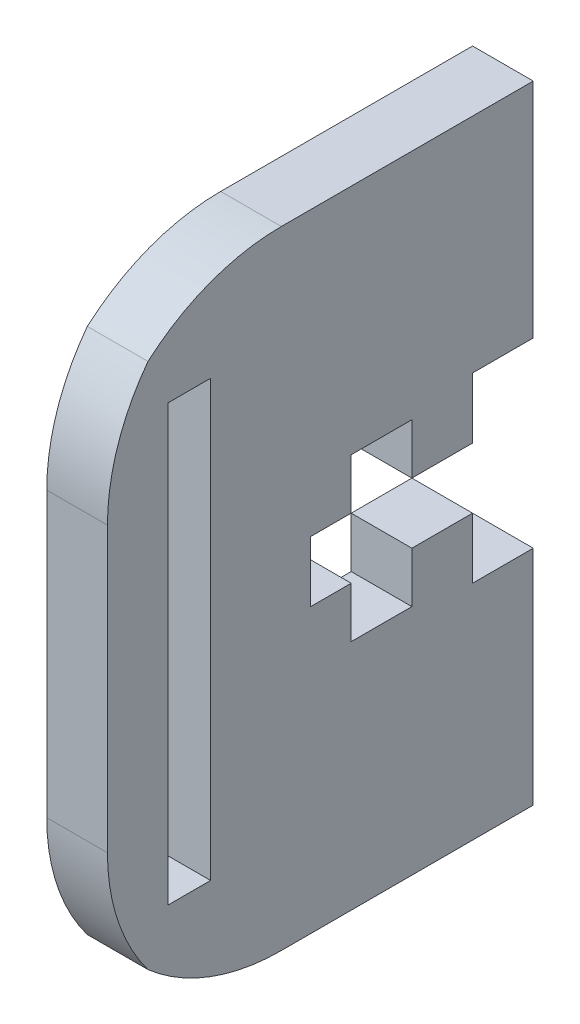
ISO-10303-21;
HEADER;
FILE_DESCRIPTION(('STEP AP214'),'2;1');
FILE_NAME('part.step','',(''),(''),'','','');
FILE_SCHEMA(('AUTOMOTIVE_DESIGN { 1 0 10303 214 1 1 1 1 }'));
ENDSEC;
DATA;
#1=APPLICATION_CONTEXT('core data for automotive mechanical design processes');
#2=APPLICATION_PROTOCOL_DEFINITION('international standard','automotive_design',2000,#1);
#3=PRODUCT_CONTEXT('',#1,'mechanical');
#4=PRODUCT('Part','Part','',(#3));
#5=PRODUCT_RELATED_PRODUCT_CATEGORY('part','',(#4));
#6=PRODUCT_DEFINITION_FORMATION('','',#4);
#7=PRODUCT_DEFINITION_CONTEXT('part definition',#1,'design');
#8=PRODUCT_DEFINITION('design','',#6,#7);
#9=PRODUCT_DEFINITION_SHAPE('','',#8);
#10=(LENGTH_UNIT() NAMED_UNIT(*) SI_UNIT(.MILLI.,.METRE.));
#11=(NAMED_UNIT(*) PLANE_ANGLE_UNIT() SI_UNIT($,.RADIAN.));
#12=(NAMED_UNIT(*) SI_UNIT($,.STERADIAN.) SOLID_ANGLE_UNIT());
#13=UNCERTAINTY_MEASURE_WITH_UNIT(LENGTH_MEASURE(1.E-05),#10,'distance_accuracy_value','');
#14=(GEOMETRIC_REPRESENTATION_CONTEXT(3) GLOBAL_UNCERTAINTY_ASSIGNED_CONTEXT((#13)) GLOBAL_UNIT_ASSIGNED_CONTEXT((#10,
#11,#12)) REPRESENTATION_CONTEXT('',''));
#15=CARTESIAN_POINT('',(0.,0.,0.));
#16=DIRECTION('',(0.,0.,1.));
#17=DIRECTION('',(1.,0.,0.));
#18=AXIS2_PLACEMENT_3D('',#15,#16,#17);
#19=CARTESIAN_POINT('',(1.5,0.,-14.));
#20=DIRECTION('',(0.,0.,1.));
#21=DIRECTION('',(1.,0.,0.));
#22=AXIS2_PLACEMENT_3D('',#19,#20,#21);
#23=PLANE('',#22);
#24=DIRECTION('',(0.,1.,0.));
#25=VECTOR('',#24,1.);
#26=CARTESIAN_POINT('',(-1.5,0.,-14.));
#27=LINE('',#26,#25);
#28=CARTESIAN_POINT('',(-1.5,-4.5,-14.));
#29=VERTEX_POINT('',#28);
#30=CARTESIAN_POINT('',(-1.5,-1.5,-14.));
#31=VERTEX_POINT('',#30);
#32=EDGE_CURVE('E277',#29,#31,#27,.T.);
#33=ORIENTED_EDGE('',*,*,#32,.T.);
#34=DIRECTION('',(1.,0.,0.));
#35=VECTOR('',#34,1.);
#36=CARTESIAN_POINT('',(-8.5,-1.5,-14.));
#37=LINE('',#36,#35);
#38=CARTESIAN_POINT('',(1.5,-1.5,-14.));
#39=VERTEX_POINT('',#38);
#40=EDGE_CURVE('E379',#31,#39,#37,.T.);
#41=ORIENTED_EDGE('',*,*,#40,.T.);
#42=DIRECTION('',(0.,1.,0.));
#43=VECTOR('',#42,1.);
#44=CARTESIAN_POINT('',(1.5,0.,-14.));
#45=LINE('',#44,#43);
#46=CARTESIAN_POINT('',(1.5,-4.5,-14.));
#47=VERTEX_POINT('',#46);
#48=EDGE_CURVE('E243',#47,#39,#45,.T.);
#49=ORIENTED_EDGE('',*,*,#48,.F.);
#50=DIRECTION('',(-1.,0.,0.));
#51=VECTOR('',#50,1.);
#52=CARTESIAN_POINT('',(1.5,-4.5,-14.));
#53=LINE('',#52,#51);
#54=EDGE_CURVE('E291',#47,#29,#53,.T.);
#55=ORIENTED_EDGE('',*,*,#54,.T.);
#56=EDGE_LOOP('',(#33,#41,#49,#55));
#57=FACE_BOUND('',#56,.T.);
#58=ADVANCED_FACE('F32',(#57),#23,.F.);
#59=CARTESIAN_POINT('',(1.5,0.,-17.));
#60=DIRECTION('',(0.,0.,1.));
#61=DIRECTION('',(1.,0.,0.));
#62=AXIS2_PLACEMENT_3D('',#59,#60,#61);
#63=PLANE('',#62);
#64=DIRECTION('',(0.,1.,0.));
#65=VECTOR('',#64,1.);
#66=CARTESIAN_POINT('',(-1.5,0.,-17.));
#67=LINE('',#66,#65);
#68=CARTESIAN_POINT('',(-1.5,-15.5,-17.));
#69=VERTEX_POINT('',#68);
#70=CARTESIAN_POINT('',(-1.5,-4.5,-17.));
#71=VERTEX_POINT('',#70);
#72=EDGE_CURVE('E270',#69,#71,#67,.T.);
#73=ORIENTED_EDGE('',*,*,#72,.T.);
#74=DIRECTION('',(-1.,0.,0.));
#75=VECTOR('',#74,1.);
#76=CARTESIAN_POINT('',(1.5,-4.5,-17.));
#77=LINE('',#76,#75);
#78=CARTESIAN_POINT('',(1.5,-4.5,-17.));
#79=VERTEX_POINT('',#78);
#80=EDGE_CURVE('E293',#79,#71,#77,.T.);
#81=ORIENTED_EDGE('',*,*,#80,.F.);
#82=DIRECTION('',(0.,1.,0.));
#83=VECTOR('',#82,1.);
#84=CARTESIAN_POINT('',(1.5,0.,-17.));
#85=LINE('',#84,#83);
#86=CARTESIAN_POINT('',(1.5,-15.5,-17.));
#87=VERTEX_POINT('',#86);
#88=EDGE_CURVE('E249',#87,#79,#85,.T.);
#89=ORIENTED_EDGE('',*,*,#88,.F.);
#90=DIRECTION('',(1.,0.,0.));
#91=VECTOR('',#90,1.);
#92=CARTESIAN_POINT('',(-1.5,-15.5,-17.));
#93=LINE('',#92,#91);
#94=EDGE_CURVE('E403',#69,#87,#93,.T.);
#95=ORIENTED_EDGE('',*,*,#94,.F.);
#96=EDGE_LOOP('',(#73,#81,#89,#95));
#97=FACE_BOUND('',#96,.T.);
#98=ADVANCED_FACE('F429',(#97),#63,.F.);
#99=CARTESIAN_POINT('',(1.5,-4.5,0.));
#100=DIRECTION('',(0.,1.,0.));
#101=DIRECTION('',(0.,0.,1.));
#102=AXIS2_PLACEMENT_3D('',#99,#100,#101);
#103=PLANE('',#102);
#104=DIRECTION('',(0.,0.,-1.));
#105=VECTOR('',#104,1.);
#106=CARTESIAN_POINT('',(-1.5,-4.5,0.));
#107=LINE('',#106,#105);
#108=EDGE_CURVE('E273',#29,#71,#107,.T.);
#109=ORIENTED_EDGE('',*,*,#108,.F.);
#110=ORIENTED_EDGE('',*,*,#54,.F.);
#111=DIRECTION('',(0.,0.,-1.));
#112=VECTOR('',#111,1.);
#113=CARTESIAN_POINT('',(1.5,-4.5,0.));
#114=LINE('',#113,#112);
#115=EDGE_CURVE('E244',#47,#79,#114,.T.);
#116=ORIENTED_EDGE('',*,*,#115,.T.);
#117=ORIENTED_EDGE('',*,*,#80,.T.);
#118=EDGE_LOOP('',(#109,#110,#116,#117));
#119=FACE_BOUND('',#118,.T.);
#120=ADVANCED_FACE('F433',(#119),#103,.T.);
#121=CARTESIAN_POINT('',(1.5,1.5,-14.));
#122=VERTEX_POINT('',#121);
#123=CARTESIAN_POINT('',(1.5,4.5,-14.));
#124=VERTEX_POINT('',#123);
#125=EDGE_CURVE('E233',#122,#124,#45,.T.);
#126=ORIENTED_EDGE('',*,*,#125,.F.);
#127=DIRECTION('',(1.,0.,0.));
#128=VECTOR('',#127,1.);
#129=CARTESIAN_POINT('',(-8.5,1.5,-14.));
#130=LINE('',#129,#128);
#131=CARTESIAN_POINT('',(-1.5,1.5,-14.));
#132=VERTEX_POINT('',#131);
#133=EDGE_CURVE('E217',#132,#122,#130,.T.);
#134=ORIENTED_EDGE('',*,*,#133,.F.);
#135=CARTESIAN_POINT('',(-1.5,4.5,-14.));
#136=VERTEX_POINT('',#135);
#137=EDGE_CURVE('E276',#132,#136,#27,.T.);
#138=ORIENTED_EDGE('',*,*,#137,.T.);
#139=DIRECTION('',(-1.,0.,0.));
#140=VECTOR('',#139,1.);
#141=CARTESIAN_POINT('',(1.5,4.5,-14.));
#142=LINE('',#141,#140);
#143=EDGE_CURVE('E241',#124,#136,#142,.T.);
#144=ORIENTED_EDGE('',*,*,#143,.F.);
#145=EDGE_LOOP('',(#126,#134,#138,#144));
#146=FACE_BOUND('',#145,.T.);
#147=ADVANCED_FACE('F239',(#146),#23,.F.);
#148=CARTESIAN_POINT('',(1.5,4.5,0.));
#149=DIRECTION('',(0.,1.,0.));
#150=DIRECTION('',(0.,0.,1.));
#151=AXIS2_PLACEMENT_3D('',#148,#149,#150);
#152=PLANE('',#151);
#153=DIRECTION('',(0.,0.,-1.));
#154=VECTOR('',#153,1.);
#155=CARTESIAN_POINT('',(-1.5,4.5,0.));
#156=LINE('',#155,#154);
#157=CARTESIAN_POINT('',(-1.5,4.5,-17.));
#158=VERTEX_POINT('',#157);
#159=EDGE_CURVE('E280',#136,#158,#156,.T.);
#160=ORIENTED_EDGE('',*,*,#159,.T.);
#161=DIRECTION('',(-1.,0.,0.));
#162=VECTOR('',#161,1.);
#163=CARTESIAN_POINT('',(1.5,4.5,-17.));
#164=LINE('',#163,#162);
#165=CARTESIAN_POINT('',(1.5,4.5,-17.));
#166=VERTEX_POINT('',#165);
#167=EDGE_CURVE('E287',#166,#158,#164,.T.);
#168=ORIENTED_EDGE('',*,*,#167,.F.);
#169=DIRECTION('',(0.,0.,-1.));
#170=VECTOR('',#169,1.);
#171=CARTESIAN_POINT('',(1.5,4.5,0.));
#172=LINE('',#171,#170);
#173=EDGE_CURVE('E247',#124,#166,#172,.T.);
#174=ORIENTED_EDGE('',*,*,#173,.F.);
#175=ORIENTED_EDGE('',*,*,#143,.T.);
#176=EDGE_LOOP('',(#160,#168,#174,#175));
#177=FACE_BOUND('',#176,.T.);
#178=ADVANCED_FACE('F471',(#177),#152,.F.);
#179=CARTESIAN_POINT('',(1.5,0.,-17.));
#180=DIRECTION('',(0.,0.,-1.));
#181=DIRECTION('',(-1.,0.,0.));
#182=AXIS2_PLACEMENT_3D('',#179,#180,#181);
#183=PLANE('',#182);
#184=DIRECTION('',(0.,-1.,0.));
#185=VECTOR('',#184,1.);
#186=CARTESIAN_POINT('',(-1.5,0.,-17.));
#187=LINE('',#186,#185);
#188=CARTESIAN_POINT('',(-1.5,15.5,-17.));
#189=VERTEX_POINT('',#188);
#190=EDGE_CURVE('E283',#189,#158,#187,.T.);
#191=ORIENTED_EDGE('',*,*,#190,.F.);
#192=DIRECTION('',(-1.,0.,0.));
#193=VECTOR('',#192,1.);
#194=CARTESIAN_POINT('',(1.5,15.5,-17.));
#195=LINE('',#194,#193);
#196=CARTESIAN_POINT('',(1.5,15.5,-17.));
#197=VERTEX_POINT('',#196);
#198=EDGE_CURVE('E411',#197,#189,#195,.T.);
#199=ORIENTED_EDGE('',*,*,#198,.F.);
#200=DIRECTION('',(0.,-1.,0.));
#201=VECTOR('',#200,1.);
#202=CARTESIAN_POINT('',(1.5,0.,-17.));
#203=LINE('',#202,#201);
#204=EDGE_CURVE('E254',#197,#166,#203,.T.);
#205=ORIENTED_EDGE('',*,*,#204,.T.);
#206=ORIENTED_EDGE('',*,*,#167,.T.);
#207=EDGE_LOOP('',(#191,#199,#205,#206));
#208=FACE_BOUND('',#207,.T.);
#209=ADVANCED_FACE('F477',(#208),#183,.T.);
#210=CARTESIAN_POINT('',(1.5,0.,-1.05));
#211=DIRECTION('',(0.,0.,1.));
#212=DIRECTION('',(1.,0.,0.));
#213=AXIS2_PLACEMENT_3D('',#210,#211,#212);
#214=PLANE('',#213);
#215=DIRECTION('',(0.,1.,0.));
#216=VECTOR('',#215,1.);
#217=CARTESIAN_POINT('',(-1.5,0.,-1.05));
#218=LINE('',#217,#216);
#219=CARTESIAN_POINT('',(-1.5,-10.75,-1.05));
#220=VERTEX_POINT('',#219);
#221=CARTESIAN_POINT('',(-1.5,10.75,-1.05));
#222=VERTEX_POINT('',#221);
#223=EDGE_CURVE('E258',#220,#222,#218,.T.);
#224=ORIENTED_EDGE('',*,*,#223,.F.);
#225=DIRECTION('',(-1.,0.,0.));
#226=VECTOR('',#225,1.);
#227=CARTESIAN_POINT('',(1.5,-10.75,-1.05));
#228=LINE('',#227,#226);
#229=CARTESIAN_POINT('',(1.5,-10.75,-1.05));
#230=VERTEX_POINT('',#229);
#231=EDGE_CURVE('E289',#230,#220,#228,.T.);
#232=ORIENTED_EDGE('',*,*,#231,.F.);
#233=DIRECTION('',(0.,1.,0.));
#234=VECTOR('',#233,1.);
#235=CARTESIAN_POINT('',(1.5,0.,-1.05));
#236=LINE('',#235,#234);
#237=CARTESIAN_POINT('',(1.5,10.75,-1.05));
#238=VERTEX_POINT('',#237);
#239=EDGE_CURVE('E286',#230,#238,#236,.T.);
#240=ORIENTED_EDGE('',*,*,#239,.T.);
#241=DIRECTION('',(-1.,0.,0.));
#242=VECTOR('',#241,1.);
#243=CARTESIAN_POINT('',(1.5,10.75,-1.05));
#244=LINE('',#243,#242);
#245=EDGE_CURVE('E257',#238,#222,#244,.T.);
#246=ORIENTED_EDGE('',*,*,#245,.T.);
#247=EDGE_LOOP('',(#224,#232,#240,#246));
#248=FACE_BOUND('',#247,.T.);
#249=ADVANCED_FACE('F538',(#248),#214,.T.);
#250=CARTESIAN_POINT('',(1.5,-10.75,0.));
#251=DIRECTION('',(0.,1.,0.));
#252=DIRECTION('',(0.,0.,1.));
#253=AXIS2_PLACEMENT_3D('',#250,#251,#252);
#254=PLANE('',#253);
#255=DIRECTION('',(0.,0.,-1.));
#256=VECTOR('',#255,1.);
#257=CARTESIAN_POINT('',(-1.5,-10.75,0.));
#258=LINE('',#257,#256);
#259=CARTESIAN_POINT('',(-1.5,-10.75,1.05));
#260=VERTEX_POINT('',#259);
#261=EDGE_CURVE('E261',#260,#220,#258,.T.);
#262=ORIENTED_EDGE('',*,*,#261,.F.);
#263=DIRECTION('',(-1.,0.,0.));
#264=VECTOR('',#263,1.);
#265=CARTESIAN_POINT('',(1.5,-10.75,1.05));
#266=LINE('',#265,#264);
#267=CARTESIAN_POINT('',(1.5,-10.75,1.05));
#268=VERTEX_POINT('',#267);
#269=EDGE_CURVE('E300',#268,#260,#266,.T.);
#270=ORIENTED_EDGE('',*,*,#269,.F.);
#271=DIRECTION('',(0.,0.,-1.));
#272=VECTOR('',#271,1.);
#273=CARTESIAN_POINT('',(1.5,-10.75,0.));
#274=LINE('',#273,#272);
#275=EDGE_CURVE('E418',#268,#230,#274,.T.);
#276=ORIENTED_EDGE('',*,*,#275,.T.);
#277=ORIENTED_EDGE('',*,*,#231,.T.);
#278=EDGE_LOOP('',(#262,#270,#276,#277));
#279=FACE_BOUND('',#278,.T.);
#280=ADVANCED_FACE('F534',(#279),#254,.T.);
#281=CARTESIAN_POINT('',(1.5,0.,1.05));
#282=DIRECTION('',(0.,0.,1.));
#283=DIRECTION('',(1.,0.,0.));
#284=AXIS2_PLACEMENT_3D('',#281,#282,#283);
#285=PLANE('',#284);
#286=DIRECTION('',(0.,1.,0.));
#287=VECTOR('',#286,1.);
#288=CARTESIAN_POINT('',(-1.5,0.,1.05));
#289=LINE('',#288,#287);
#290=CARTESIAN_POINT('',(-1.5,10.75,1.05));
#291=VERTEX_POINT('',#290);
#292=EDGE_CURVE('E265',#260,#291,#289,.T.);
#293=ORIENTED_EDGE('',*,*,#292,.T.);
#294=DIRECTION('',(-1.,0.,0.));
#295=VECTOR('',#294,1.);
#296=CARTESIAN_POINT('',(1.5,10.75,1.05));
#297=LINE('',#296,#295);
#298=CARTESIAN_POINT('',(1.5,10.75,1.05));
#299=VERTEX_POINT('',#298);
#300=EDGE_CURVE('E297',#299,#291,#297,.T.);
#301=ORIENTED_EDGE('',*,*,#300,.F.);
#302=DIRECTION('',(0.,1.,0.));
#303=VECTOR('',#302,1.);
#304=CARTESIAN_POINT('',(1.5,0.,1.05));
#305=LINE('',#304,#303);
#306=EDGE_CURVE('E421',#268,#299,#305,.T.);
#307=ORIENTED_EDGE('',*,*,#306,.F.);
#308=ORIENTED_EDGE('',*,*,#269,.T.);
#309=EDGE_LOOP('',(#293,#301,#307,#308));
#310=FACE_BOUND('',#309,.T.);
#311=ADVANCED_FACE('F530',(#310),#285,.F.);
#312=CARTESIAN_POINT('',(1.5,10.75,0.));
#313=DIRECTION('',(0.,1.,0.));
#314=DIRECTION('',(0.,0.,1.));
#315=AXIS2_PLACEMENT_3D('',#312,#313,#314);
#316=PLANE('',#315);
#317=DIRECTION('',(0.,0.,-1.));
#318=VECTOR('',#317,1.);
#319=CARTESIAN_POINT('',(-1.5,10.75,0.));
#320=LINE('',#319,#318);
#321=EDGE_CURVE('E267',#291,#222,#320,.T.);
#322=ORIENTED_EDGE('',*,*,#321,.T.);
#323=ORIENTED_EDGE('',*,*,#245,.F.);
#324=DIRECTION('',(0.,0.,-1.));
#325=VECTOR('',#324,1.);
#326=CARTESIAN_POINT('',(1.5,10.75,0.));
#327=LINE('',#326,#325);
#328=EDGE_CURVE('E423',#299,#238,#327,.T.);
#329=ORIENTED_EDGE('',*,*,#328,.F.);
#330=ORIENTED_EDGE('',*,*,#300,.T.);
#331=EDGE_LOOP('',(#322,#323,#329,#330));
#332=FACE_BOUND('',#331,.T.);
#333=ADVANCED_FACE('F527',(#332),#316,.F.);
#334=CARTESIAN_POINT('',(1.5,0.,0.));
#335=DIRECTION('',(1.,0.,0.));
#336=DIRECTION('',(0.,0.,-1.));
#337=AXIS2_PLACEMENT_3D('',#334,#335,#336);
#338=PLANE('',#337);
#339=DIRECTION('',(0.,0.,-1.));
#340=VECTOR('',#339,1.);
#341=CARTESIAN_POINT('',(1.5,-1.5,-14.));
#342=LINE('',#341,#340);
#343=CARTESIAN_POINT('',(1.5,-1.5,-11.));
#344=VERTEX_POINT('',#343);
#345=EDGE_CURVE('E227',#344,#39,#342,.T.);
#346=ORIENTED_EDGE('',*,*,#345,.F.);
#347=DIRECTION('',(0.,1.,0.));
#348=VECTOR('',#347,1.);
#349=CARTESIAN_POINT('',(1.5,-1.5,-11.));
#350=LINE('',#349,#348);
#351=CARTESIAN_POINT('',(1.5,-4.,-11.));
#352=VERTEX_POINT('',#351);
#353=EDGE_CURVE('E437',#352,#344,#350,.T.);
#354=ORIENTED_EDGE('',*,*,#353,.F.);
#355=DIRECTION('',(0.,0.,-1.));
#356=VECTOR('',#355,1.);
#357=CARTESIAN_POINT('',(1.5,-4.,-11.));
#358=LINE('',#357,#356);
#359=CARTESIAN_POINT('',(1.5,-4.,-8.));
#360=VERTEX_POINT('',#359);
#361=EDGE_CURVE('E375',#360,#352,#358,.T.);
#362=ORIENTED_EDGE('',*,*,#361,.F.);
#363=DIRECTION('',(0.,-1.,0.));
#364=VECTOR('',#363,1.);
#365=CARTESIAN_POINT('',(1.5,-4.,-8.));
#366=LINE('',#365,#364);
#367=CARTESIAN_POINT('',(1.5,-1.5,-8.));
#368=VERTEX_POINT('',#367);
#369=EDGE_CURVE('E443',#368,#360,#366,.T.);
#370=ORIENTED_EDGE('',*,*,#369,.F.);
#371=DIRECTION('',(0.,0.,-1.));
#372=VECTOR('',#371,1.);
#373=CARTESIAN_POINT('',(1.5,-1.5,-8.));
#374=LINE('',#373,#372);
#375=CARTESIAN_POINT('',(1.5,-1.5,-6.));
#376=VERTEX_POINT('',#375);
#377=EDGE_CURVE('E446',#376,#368,#374,.T.);
#378=ORIENTED_EDGE('',*,*,#377,.F.);
#379=DIRECTION('',(0.,-1.,0.));
#380=VECTOR('',#379,1.);
#381=CARTESIAN_POINT('',(1.5,1.5,-6.));
#382=LINE('',#381,#380);
#383=CARTESIAN_POINT('',(1.5,1.5,-6.));
#384=VERTEX_POINT('',#383);
#385=EDGE_CURVE('E449',#384,#376,#382,.T.);
#386=ORIENTED_EDGE('',*,*,#385,.F.);
#387=DIRECTION('',(0.,0.,1.));
#388=VECTOR('',#387,1.);
#389=CARTESIAN_POINT('',(1.5,1.5,-8.));
#390=LINE('',#389,#388);
#391=CARTESIAN_POINT('',(1.5,1.5,-8.));
#392=VERTEX_POINT('',#391);
#393=EDGE_CURVE('E452',#392,#384,#390,.T.);
#394=ORIENTED_EDGE('',*,*,#393,.F.);
#395=DIRECTION('',(0.,-1.,0.));
#396=VECTOR('',#395,1.);
#397=CARTESIAN_POINT('',(1.5,4.,-8.));
#398=LINE('',#397,#396);
#399=CARTESIAN_POINT('',(1.5,4.,-8.));
#400=VERTEX_POINT('',#399);
#401=EDGE_CURVE('E455',#400,#392,#398,.T.);
#402=ORIENTED_EDGE('',*,*,#401,.F.);
#403=DIRECTION('',(0.,0.,1.));
#404=VECTOR('',#403,1.);
#405=CARTESIAN_POINT('',(1.5,4.,-11.));
#406=LINE('',#405,#404);
#407=CARTESIAN_POINT('',(1.5,4.,-11.));
#408=VERTEX_POINT('',#407);
#409=EDGE_CURVE('E458',#408,#400,#406,.T.);
#410=ORIENTED_EDGE('',*,*,#409,.F.);
#411=DIRECTION('',(0.,1.,0.));
#412=VECTOR('',#411,1.);
#413=CARTESIAN_POINT('',(1.5,1.5,-11.));
#414=LINE('',#413,#412);
#415=CARTESIAN_POINT('',(1.5,1.5,-11.));
#416=VERTEX_POINT('',#415);
#417=EDGE_CURVE('E237',#416,#408,#414,.T.);
#418=ORIENTED_EDGE('',*,*,#417,.F.);
#419=DIRECTION('',(0.,0.,1.));
#420=VECTOR('',#419,1.);
#421=CARTESIAN_POINT('',(1.5,1.5,-14.));
#422=LINE('',#421,#420);
#423=EDGE_CURVE('E220',#122,#416,#422,.T.);
#424=ORIENTED_EDGE('',*,*,#423,.F.);
#425=ORIENTED_EDGE('',*,*,#125,.T.);
#426=ORIENTED_EDGE('',*,*,#173,.T.);
#427=ORIENTED_EDGE('',*,*,#204,.F.);
#428=DIRECTION('',(0.,0.,-1.));
#429=VECTOR('',#428,1.);
#430=CARTESIAN_POINT('',(1.5,15.5,0.));
#431=LINE('',#430,#429);
#432=CARTESIAN_POINT('',(1.5,15.5,-4.54708295903304));
#433=VERTEX_POINT('',#432);
#434=EDGE_CURVE('E409',#433,#197,#431,.T.);
#435=ORIENTED_EDGE('',*,*,#434,.F.);
#436=CARTESIAN_POINT('',(1.5,5.5,-4.54708295903304));
#437=DIRECTION('',(1.,0.,0.));
#438=DIRECTION('',(0.,0.,-1.));
#439=AXIS2_PLACEMENT_3D('',#436,#437,#438);
#440=CIRCLE('',#439,10.);
#441=CARTESIAN_POINT('',(1.5,13.0192307692308,2.04542556497004));
#442=VERTEX_POINT('',#441);
#443=EDGE_CURVE('E313',#433,#442,#440,.T.);
#444=ORIENTED_EDGE('',*,*,#443,.T.);
#445=CARTESIAN_POINT('',(1.5,7.01313636146264,-5.95));
#446=DIRECTION('',(1.,0.,0.));
#447=DIRECTION('',(0.,0.,-1.));
#448=AXIS2_PLACEMENT_3D('',#445,#446,#447);
#449=CIRCLE('',#448,10.);
#450=CARTESIAN_POINT('',(1.5,7.01313636146264,4.05));
#451=VERTEX_POINT('',#450);
#452=EDGE_CURVE('E326',#442,#451,#449,.T.);
#453=ORIENTED_EDGE('',*,*,#452,.T.);
#454=DIRECTION('',(0.,1.,0.));
#455=VECTOR('',#454,1.);
#456=CARTESIAN_POINT('',(1.5,18.2535367391335,4.05));
#457=LINE('',#456,#455);
#458=CARTESIAN_POINT('',(1.5,-7.01313636146264,4.05));
#459=VERTEX_POINT('',#458);
#460=EDGE_CURVE('E397',#459,#451,#457,.T.);
#461=ORIENTED_EDGE('',*,*,#460,.F.);
#462=CARTESIAN_POINT('',(1.5,-7.01313636146264,-5.95000000000001));
#463=DIRECTION('',(1.,0.,0.));
#464=DIRECTION('',(0.,0.,-1.));
#465=AXIS2_PLACEMENT_3D('',#462,#463,#464);
#466=CIRCLE('',#465,10.);
#467=CARTESIAN_POINT('',(1.5,-13.0192307692308,2.04542556497003));
#468=VERTEX_POINT('',#467);
#469=EDGE_CURVE('E324',#459,#468,#466,.T.);
#470=ORIENTED_EDGE('',*,*,#469,.T.);
#471=CARTESIAN_POINT('',(1.5,-5.5,-4.54708295903305));
#472=DIRECTION('',(1.,0.,0.));
#473=DIRECTION('',(0.,0.,-1.));
#474=AXIS2_PLACEMENT_3D('',#471,#472,#473);
#475=CIRCLE('',#474,10.);
#476=CARTESIAN_POINT('',(1.5,-15.5,-4.54708295903305));
#477=VERTEX_POINT('',#476);
#478=EDGE_CURVE('E316',#468,#477,#475,.T.);
#479=ORIENTED_EDGE('',*,*,#478,.T.);
#480=DIRECTION('',(0.,0.,1.));
#481=VECTOR('',#480,1.);
#482=CARTESIAN_POINT('',(1.5,-15.5,-17.));
#483=LINE('',#482,#481);
#484=EDGE_CURVE('E406',#87,#477,#483,.T.);
#485=ORIENTED_EDGE('',*,*,#484,.F.);
#486=ORIENTED_EDGE('',*,*,#88,.T.);
#487=ORIENTED_EDGE('',*,*,#115,.F.);
#488=ORIENTED_EDGE('',*,*,#48,.T.);
#489=EDGE_LOOP('',(#346,#354,#362,#370,#378,#386,#394,#402,#410,#418,#424,#425,#426,#427,#435,
#444,#453,#461,#470,#479,#485,#486,#487,#488));
#490=FACE_BOUND('',#489,.T.);
#491=ORIENTED_EDGE('',*,*,#239,.F.);
#492=ORIENTED_EDGE('',*,*,#275,.F.);
#493=ORIENTED_EDGE('',*,*,#306,.T.);
#494=ORIENTED_EDGE('',*,*,#328,.T.);
#495=EDGE_LOOP('',(#491,#492,#493,#494));
#496=FACE_BOUND('',#495,.T.);
#497=ADVANCED_FACE('F231',(#490,#496),#338,.T.);
#498=CARTESIAN_POINT('',(-1.5,0.,0.));
#499=DIRECTION('',(1.,0.,0.));
#500=DIRECTION('',(0.,0.,-1.));
#501=AXIS2_PLACEMENT_3D('',#498,#499,#500);
#502=PLANE('',#501);
#503=ORIENTED_EDGE('',*,*,#223,.T.);
#504=ORIENTED_EDGE('',*,*,#321,.F.);
#505=ORIENTED_EDGE('',*,*,#292,.F.);
#506=ORIENTED_EDGE('',*,*,#261,.T.);
#507=EDGE_LOOP('',(#503,#504,#505,#506));
#508=FACE_BOUND('',#507,.T.);
#509=DIRECTION('',(0.,1.,0.));
#510=VECTOR('',#509,1.);
#511=CARTESIAN_POINT('',(-1.5,0.,-11.));
#512=LINE('',#511,#510);
#513=CARTESIAN_POINT('',(-1.5,-4.,-11.));
#514=VERTEX_POINT('',#513);
#515=CARTESIAN_POINT('',(-1.5,-1.5,-11.));
#516=VERTEX_POINT('',#515);
#517=EDGE_CURVE('E40',#514,#516,#512,.T.);
#518=ORIENTED_EDGE('',*,*,#517,.T.);
#519=DIRECTION('',(0.,0.,-1.));
#520=VECTOR('',#519,1.);
#521=CARTESIAN_POINT('',(-1.5,-1.5,0.));
#522=LINE('',#521,#520);
#523=EDGE_CURVE('E11',#516,#31,#522,.T.);
#524=ORIENTED_EDGE('',*,*,#523,.T.);
#525=ORIENTED_EDGE('',*,*,#32,.F.);
#526=ORIENTED_EDGE('',*,*,#108,.T.);
#527=ORIENTED_EDGE('',*,*,#72,.F.);
#528=DIRECTION('',(0.,0.,-1.));
#529=VECTOR('',#528,1.);
#530=CARTESIAN_POINT('',(-1.5,-15.5,0.));
#531=LINE('',#530,#529);
#532=CARTESIAN_POINT('',(-1.5,-15.5,-4.54708295903305));
#533=VERTEX_POINT('',#532);
#534=EDGE_CURVE('E401',#533,#69,#531,.T.);
#535=ORIENTED_EDGE('',*,*,#534,.F.);
#536=CARTESIAN_POINT('',(-1.5,-5.5,-4.54708295903305));
#537=DIRECTION('',(1.,0.,0.));
#538=DIRECTION('',(0.,0.,-1.));
#539=AXIS2_PLACEMENT_3D('',#536,#537,#538);
#540=CIRCLE('',#539,10.);
#541=CARTESIAN_POINT('',(-1.5,-13.0192307692308,2.04542556497003));
#542=VERTEX_POINT('',#541);
#543=EDGE_CURVE('E307',#533,#542,#540,.F.);
#544=ORIENTED_EDGE('',*,*,#543,.T.);
#545=CARTESIAN_POINT('',(-1.5,-7.01313636146264,-5.95000000000001));
#546=DIRECTION('',(1.,0.,0.));
#547=DIRECTION('',(0.,0.,-1.));
#548=AXIS2_PLACEMENT_3D('',#545,#546,#547);
#549=CIRCLE('',#548,10.);
#550=CARTESIAN_POINT('',(-1.5,-7.01313636146264,4.05));
#551=VERTEX_POINT('',#550);
#552=EDGE_CURVE('E331',#542,#551,#549,.F.);
#553=ORIENTED_EDGE('',*,*,#552,.T.);
#554=DIRECTION('',(0.,1.,0.));
#555=VECTOR('',#554,1.);
#556=CARTESIAN_POINT('',(-1.5,0.,4.05));
#557=LINE('',#556,#555);
#558=CARTESIAN_POINT('',(-1.5,7.01313636146264,4.05));
#559=VERTEX_POINT('',#558);
#560=EDGE_CURVE('E399',#551,#559,#557,.T.);
#561=ORIENTED_EDGE('',*,*,#560,.T.);
#562=CARTESIAN_POINT('',(-1.5,7.01313636146264,-5.95));
#563=DIRECTION('',(1.,0.,0.));
#564=DIRECTION('',(0.,0.,-1.));
#565=AXIS2_PLACEMENT_3D('',#562,#563,#564);
#566=CIRCLE('',#565,10.);
#567=CARTESIAN_POINT('',(-1.5,13.0192307692308,2.04542556497004));
#568=VERTEX_POINT('',#567);
#569=EDGE_CURVE('E333',#559,#568,#566,.F.);
#570=ORIENTED_EDGE('',*,*,#569,.T.);
#571=CARTESIAN_POINT('',(-1.5,5.5,-4.54708295903304));
#572=DIRECTION('',(1.,0.,0.));
#573=DIRECTION('',(0.,0.,-1.));
#574=AXIS2_PLACEMENT_3D('',#571,#572,#573);
#575=CIRCLE('',#574,10.);
#576=CARTESIAN_POINT('',(-1.5,15.5,-4.54708295903304));
#577=VERTEX_POINT('',#576);
#578=EDGE_CURVE('E305',#568,#577,#575,.F.);
#579=ORIENTED_EDGE('',*,*,#578,.T.);
#580=DIRECTION('',(0.,0.,1.));
#581=VECTOR('',#580,1.);
#582=CARTESIAN_POINT('',(-1.5,15.5,-17.));
#583=LINE('',#582,#581);
#584=EDGE_CURVE('E262',#189,#577,#583,.T.);
#585=ORIENTED_EDGE('',*,*,#584,.F.);
#586=ORIENTED_EDGE('',*,*,#190,.T.);
#587=ORIENTED_EDGE('',*,*,#159,.F.);
#588=ORIENTED_EDGE('',*,*,#137,.F.);
#589=DIRECTION('',(0.,0.,1.));
#590=VECTOR('',#589,1.);
#591=CARTESIAN_POINT('',(-1.5,1.5,0.));
#592=LINE('',#591,#590);
#593=CARTESIAN_POINT('',(-1.5,1.5,-11.));
#594=VERTEX_POINT('',#593);
#595=EDGE_CURVE('E223',#132,#594,#592,.T.);
#596=ORIENTED_EDGE('',*,*,#595,.T.);
#597=DIRECTION('',(0.,1.,0.));
#598=VECTOR('',#597,1.);
#599=CARTESIAN_POINT('',(-1.5,0.,-11.));
#600=LINE('',#599,#598);
#601=CARTESIAN_POINT('',(-1.5,4.,-11.));
#602=VERTEX_POINT('',#601);
#603=EDGE_CURVE('E336',#594,#602,#600,.T.);
#604=ORIENTED_EDGE('',*,*,#603,.T.);
#605=DIRECTION('',(0.,0.,1.));
#606=VECTOR('',#605,1.);
#607=CARTESIAN_POINT('',(-1.5,4.,0.));
#608=LINE('',#607,#606);
#609=CARTESIAN_POINT('',(-1.5,4.,-8.));
#610=VERTEX_POINT('',#609);
#611=EDGE_CURVE('E339',#602,#610,#608,.T.);
#612=ORIENTED_EDGE('',*,*,#611,.T.);
#613=DIRECTION('',(0.,-1.,0.));
#614=VECTOR('',#613,1.);
#615=CARTESIAN_POINT('',(-1.5,0.,-8.));
#616=LINE('',#615,#614);
#617=CARTESIAN_POINT('',(-1.5,1.5,-8.));
#618=VERTEX_POINT('',#617);
#619=EDGE_CURVE('E342',#610,#618,#616,.T.);
#620=ORIENTED_EDGE('',*,*,#619,.T.);
#621=DIRECTION('',(0.,0.,1.));
#622=VECTOR('',#621,1.);
#623=CARTESIAN_POINT('',(-1.5,1.5,0.));
#624=LINE('',#623,#622);
#625=CARTESIAN_POINT('',(-1.5,1.5,-6.));
#626=VERTEX_POINT('',#625);
#627=EDGE_CURVE('E345',#618,#626,#624,.T.);
#628=ORIENTED_EDGE('',*,*,#627,.T.);
#629=DIRECTION('',(0.,-1.,0.));
#630=VECTOR('',#629,1.);
#631=CARTESIAN_POINT('',(-1.5,0.,-6.));
#632=LINE('',#631,#630);
#633=CARTESIAN_POINT('',(-1.5,-1.5,-6.));
#634=VERTEX_POINT('',#633);
#635=EDGE_CURVE('E348',#626,#634,#632,.T.);
#636=ORIENTED_EDGE('',*,*,#635,.T.);
#637=DIRECTION('',(0.,0.,-1.));
#638=VECTOR('',#637,1.);
#639=CARTESIAN_POINT('',(-1.5,-1.5,0.));
#640=LINE('',#639,#638);
#641=CARTESIAN_POINT('',(-1.5,-1.5,-8.));
#642=VERTEX_POINT('',#641);
#643=EDGE_CURVE('E351',#634,#642,#640,.T.);
#644=ORIENTED_EDGE('',*,*,#643,.T.);
#645=DIRECTION('',(0.,-1.,0.));
#646=VECTOR('',#645,1.);
#647=CARTESIAN_POINT('',(-1.5,0.,-8.));
#648=LINE('',#647,#646);
#649=CARTESIAN_POINT('',(-1.5,-4.,-8.));
#650=VERTEX_POINT('',#649);
#651=EDGE_CURVE('E354',#642,#650,#648,.T.);
#652=ORIENTED_EDGE('',*,*,#651,.T.);
#653=DIRECTION('',(0.,0.,-1.));
#654=VECTOR('',#653,1.);
#655=CARTESIAN_POINT('',(-1.5,-4.,0.));
#656=LINE('',#655,#654);
#657=EDGE_CURVE('E357',#650,#514,#656,.T.);
#658=ORIENTED_EDGE('',*,*,#657,.T.);
#659=EDGE_LOOP('',(#518,#524,#525,#526,#527,#535,#544,#553,#561,#570,#579,#585,#586,#587,#588,
#596,#604,#612,#620,#628,#636,#644,#652,#658));
#660=FACE_BOUND('',#659,.T.);
#661=ADVANCED_FACE('F361',(#508,#660),#502,.F.);
#662=CARTESIAN_POINT('',(0.,15.5,0.));
#663=DIRECTION('',(0.,1.,0.));
#664=DIRECTION('',(0.,0.,1.));
#665=AXIS2_PLACEMENT_3D('',#662,#663,#664);
#666=PLANE('',#665);
#667=ORIENTED_EDGE('',*,*,#584,.T.);
#668=DIRECTION('',(1.,0.,0.));
#669=VECTOR('',#668,1.);
#670=CARTESIAN_POINT('',(1.5,15.5,-4.54708295903304));
#671=LINE('',#670,#669);
#672=EDGE_CURVE('E318',#577,#433,#671,.T.);
#673=ORIENTED_EDGE('',*,*,#672,.T.);
#674=ORIENTED_EDGE('',*,*,#434,.T.);
#675=ORIENTED_EDGE('',*,*,#198,.T.);
#676=EDGE_LOOP('',(#667,#673,#674,#675));
#677=FACE_BOUND('',#676,.T.);
#678=ADVANCED_FACE('F480',(#677),#666,.T.);
#679=CARTESIAN_POINT('',(0.,-15.5,0.));
#680=DIRECTION('',(0.,-1.,0.));
#681=DIRECTION('',(0.,0.,-1.));
#682=AXIS2_PLACEMENT_3D('',#679,#680,#681);
#683=PLANE('',#682);
#684=ORIENTED_EDGE('',*,*,#484,.T.);
#685=DIRECTION('',(-1.,0.,0.));
#686=VECTOR('',#685,1.);
#687=CARTESIAN_POINT('',(-1.5,-15.5,-4.54708295903305));
#688=LINE('',#687,#686);
#689=EDGE_CURVE('E295',#477,#533,#688,.T.);
#690=ORIENTED_EDGE('',*,*,#689,.T.);
#691=ORIENTED_EDGE('',*,*,#534,.T.);
#692=ORIENTED_EDGE('',*,*,#94,.T.);
#693=EDGE_LOOP('',(#684,#690,#691,#692));
#694=FACE_BOUND('',#693,.T.);
#695=ADVANCED_FACE('F501',(#694),#683,.T.);
#696=CARTESIAN_POINT('',(1.5,-5.5,-4.54708295903305));
#697=DIRECTION('',(1.,0.,0.));
#698=DIRECTION('',(0.,0.,-1.));
#699=AXIS2_PLACEMENT_3D('',#696,#697,#698);
#700=CYLINDRICAL_SURFACE('',#699,10.);
#701=ORIENTED_EDGE('',*,*,#478,.F.);
#702=DIRECTION('',(1.,0.,0.));
#703=VECTOR('',#702,1.);
#704=CARTESIAN_POINT('',(1.5,-13.0192307692308,2.04542556497003));
#705=LINE('',#704,#703);
#706=EDGE_CURVE('E310',#542,#468,#705,.T.);
#707=ORIENTED_EDGE('',*,*,#706,.F.);
#708=ORIENTED_EDGE('',*,*,#543,.F.);
#709=ORIENTED_EDGE('',*,*,#689,.F.);
#710=EDGE_LOOP('',(#701,#707,#708,#709));
#711=FACE_BOUND('',#710,.T.);
#712=ADVANCED_FACE('F498',(#711),#700,.T.);
#713=CARTESIAN_POINT('',(1.5,5.5,-4.54708295903304));
#714=DIRECTION('',(-1.,0.,0.));
#715=DIRECTION('',(0.,0.,1.));
#716=AXIS2_PLACEMENT_3D('',#713,#714,#715);
#717=CYLINDRICAL_SURFACE('',#716,10.);
#718=ORIENTED_EDGE('',*,*,#578,.F.);
#719=DIRECTION('',(-1.,0.,0.));
#720=VECTOR('',#719,1.);
#721=CARTESIAN_POINT('',(1.5,13.0192307692308,2.04542556497004));
#722=LINE('',#721,#720);
#723=EDGE_CURVE('E321',#442,#568,#722,.T.);
#724=ORIENTED_EDGE('',*,*,#723,.F.);
#725=ORIENTED_EDGE('',*,*,#443,.F.);
#726=ORIENTED_EDGE('',*,*,#672,.F.);
#727=EDGE_LOOP('',(#718,#724,#725,#726));
#728=FACE_BOUND('',#727,.T.);
#729=ADVANCED_FACE('F486',(#728),#717,.T.);
#730=CARTESIAN_POINT('',(-8.5,18.2535367391335,4.05));
#731=DIRECTION('',(0.,0.,-1.));
#732=DIRECTION('',(0.,1.,0.));
#733=AXIS2_PLACEMENT_3D('',#730,#731,#732);
#734=PLANE('',#733);
#735=ORIENTED_EDGE('',*,*,#460,.T.);
#736=DIRECTION('',(-1.,0.,0.));
#737=VECTOR('',#736,1.);
#738=CARTESIAN_POINT('',(-8.5,7.01313636146264,4.05));
#739=LINE('',#738,#737);
#740=EDGE_CURVE('E55',#451,#559,#739,.T.);
#741=ORIENTED_EDGE('',*,*,#740,.T.);
#742=ORIENTED_EDGE('',*,*,#560,.F.);
#743=DIRECTION('',(1.,0.,0.));
#744=VECTOR('',#743,1.);
#745=CARTESIAN_POINT('',(-8.5,-7.01313636146264,4.05));
#746=LINE('',#745,#744);
#747=EDGE_CURVE('E328',#551,#459,#746,.T.);
#748=ORIENTED_EDGE('',*,*,#747,.T.);
#749=EDGE_LOOP('',(#735,#741,#742,#748));
#750=FACE_BOUND('',#749,.T.);
#751=ADVANCED_FACE('F491',(#750),#734,.F.);
#752=CARTESIAN_POINT('',(1.5,7.01313636146264,-5.95));
#753=DIRECTION('',(-1.,0.,0.));
#754=DIRECTION('',(0.,0.,1.));
#755=AXIS2_PLACEMENT_3D('',#752,#753,#754);
#756=CYLINDRICAL_SURFACE('',#755,10.);
#757=ORIENTED_EDGE('',*,*,#569,.F.);
#758=ORIENTED_EDGE('',*,*,#740,.F.);
#759=ORIENTED_EDGE('',*,*,#452,.F.);
#760=ORIENTED_EDGE('',*,*,#723,.T.);
#761=EDGE_LOOP('',(#757,#758,#759,#760));
#762=FACE_BOUND('',#761,.T.);
#763=ADVANCED_FACE('F488',(#762),#756,.T.);
#764=CARTESIAN_POINT('',(1.5,-7.01313636146264,-5.95000000000001));
#765=DIRECTION('',(1.,0.,0.));
#766=DIRECTION('',(0.,0.,-1.));
#767=AXIS2_PLACEMENT_3D('',#764,#765,#766);
#768=CYLINDRICAL_SURFACE('',#767,10.);
#769=ORIENTED_EDGE('',*,*,#469,.F.);
#770=ORIENTED_EDGE('',*,*,#747,.F.);
#771=ORIENTED_EDGE('',*,*,#552,.F.);
#772=ORIENTED_EDGE('',*,*,#706,.T.);
#773=EDGE_LOOP('',(#769,#770,#771,#772));
#774=FACE_BOUND('',#773,.T.);
#775=ADVANCED_FACE('F34',(#774),#768,.T.);
#776=CARTESIAN_POINT('',(-8.5,-1.5,-14.));
#777=DIRECTION('',(0.,-1.,0.));
#778=DIRECTION('',(0.,0.,-1.));
#779=AXIS2_PLACEMENT_3D('',#776,#777,#778);
#780=PLANE('',#779);
#781=DIRECTION('',(1.,0.,0.));
#782=VECTOR('',#781,1.);
#783=CARTESIAN_POINT('',(-8.5,-1.5,-11.));
#784=LINE('',#783,#782);
#785=EDGE_CURVE('E370',#516,#344,#784,.T.);
#786=ORIENTED_EDGE('',*,*,#785,.T.);
#787=ORIENTED_EDGE('',*,*,#345,.T.);
#788=ORIENTED_EDGE('',*,*,#40,.F.);
#789=ORIENTED_EDGE('',*,*,#523,.F.);
#790=EDGE_LOOP('',(#786,#787,#788,#789));
#791=FACE_BOUND('',#790,.T.);
#792=ADVANCED_FACE('F549',(#791),#780,.F.);
#793=CARTESIAN_POINT('',(-8.5,-1.5,-11.));
#794=DIRECTION('',(0.,0.,-1.));
#795=DIRECTION('',(-1.,0.,0.));
#796=AXIS2_PLACEMENT_3D('',#793,#794,#795);
#797=PLANE('',#796);
#798=DIRECTION('',(1.,0.,0.));
#799=VECTOR('',#798,1.);
#800=CARTESIAN_POINT('',(-8.5,-4.,-11.));
#801=LINE('',#800,#799);
#802=EDGE_CURVE('E368',#514,#352,#801,.T.);
#803=ORIENTED_EDGE('',*,*,#802,.T.);
#804=ORIENTED_EDGE('',*,*,#353,.T.);
#805=ORIENTED_EDGE('',*,*,#785,.F.);
#806=ORIENTED_EDGE('',*,*,#517,.F.);
#807=EDGE_LOOP('',(#803,#804,#805,#806));
#808=FACE_BOUND('',#807,.T.);
#809=ADVANCED_FACE('F366',(#808),#797,.F.);
#810=CARTESIAN_POINT('',(-8.5,-4.,-11.));
#811=DIRECTION('',(0.,-1.,0.));
#812=DIRECTION('',(0.,0.,-1.));
#813=AXIS2_PLACEMENT_3D('',#810,#811,#812);
#814=PLANE('',#813);
#815=DIRECTION('',(1.,0.,0.));
#816=VECTOR('',#815,1.);
#817=CARTESIAN_POINT('',(-8.5,-4.,-8.));
#818=LINE('',#817,#816);
#819=EDGE_CURVE('E377',#650,#360,#818,.T.);
#820=ORIENTED_EDGE('',*,*,#819,.T.);
#821=ORIENTED_EDGE('',*,*,#361,.T.);
#822=ORIENTED_EDGE('',*,*,#802,.F.);
#823=ORIENTED_EDGE('',*,*,#657,.F.);
#824=EDGE_LOOP('',(#820,#821,#822,#823));
#825=FACE_BOUND('',#824,.T.);
#826=ADVANCED_FACE('F372',(#825),#814,.F.);
#827=CARTESIAN_POINT('',(-8.5,-4.,-8.));
#828=DIRECTION('',(0.,0.,1.));
#829=DIRECTION('',(1.,0.,0.));
#830=AXIS2_PLACEMENT_3D('',#827,#828,#829);
#831=PLANE('',#830);
#832=DIRECTION('',(1.,0.,0.));
#833=VECTOR('',#832,1.);
#834=CARTESIAN_POINT('',(-8.5,-1.5,-8.));
#835=LINE('',#834,#833);
#836=EDGE_CURVE('E381',#642,#368,#835,.T.);
#837=ORIENTED_EDGE('',*,*,#836,.T.);
#838=ORIENTED_EDGE('',*,*,#369,.T.);
#839=ORIENTED_EDGE('',*,*,#819,.F.);
#840=ORIENTED_EDGE('',*,*,#651,.F.);
#841=EDGE_LOOP('',(#837,#838,#839,#840));
#842=FACE_BOUND('',#841,.T.);
#843=ADVANCED_FACE('F574',(#842),#831,.F.);
#844=CARTESIAN_POINT('',(-8.5,-1.5,-8.));
#845=DIRECTION('',(0.,-1.,0.));
#846=DIRECTION('',(0.,0.,-1.));
#847=AXIS2_PLACEMENT_3D('',#844,#845,#846);
#848=PLANE('',#847);
#849=DIRECTION('',(1.,0.,0.));
#850=VECTOR('',#849,1.);
#851=CARTESIAN_POINT('',(-8.5,-1.5,-6.));
#852=LINE('',#851,#850);
#853=EDGE_CURVE('E386',#634,#376,#852,.T.);
#854=ORIENTED_EDGE('',*,*,#853,.T.);
#855=ORIENTED_EDGE('',*,*,#377,.T.);
#856=ORIENTED_EDGE('',*,*,#836,.F.);
#857=ORIENTED_EDGE('',*,*,#643,.F.);
#858=EDGE_LOOP('',(#854,#855,#856,#857));
#859=FACE_BOUND('',#858,.T.);
#860=ADVANCED_FACE('F570',(#859),#848,.F.);
#861=CARTESIAN_POINT('',(-8.5,1.5,-6.));
#862=DIRECTION('',(0.,0.,1.));
#863=DIRECTION('',(1.,0.,0.));
#864=AXIS2_PLACEMENT_3D('',#861,#862,#863);
#865=PLANE('',#864);
#866=DIRECTION('',(1.,0.,0.));
#867=VECTOR('',#866,1.);
#868=CARTESIAN_POINT('',(-8.5,1.5,-6.));
#869=LINE('',#868,#867);
#870=EDGE_CURVE('E388',#626,#384,#869,.T.);
#871=ORIENTED_EDGE('',*,*,#870,.T.);
#872=ORIENTED_EDGE('',*,*,#385,.T.);
#873=ORIENTED_EDGE('',*,*,#853,.F.);
#874=ORIENTED_EDGE('',*,*,#635,.F.);
#875=EDGE_LOOP('',(#871,#872,#873,#874));
#876=FACE_BOUND('',#875,.T.);
#877=ADVANCED_FACE('F566',(#876),#865,.F.);
#878=CARTESIAN_POINT('',(-8.5,1.5,-8.));
#879=DIRECTION('',(0.,1.,0.));
#880=DIRECTION('',(0.,0.,1.));
#881=AXIS2_PLACEMENT_3D('',#878,#879,#880);
#882=PLANE('',#881);
#883=DIRECTION('',(1.,0.,0.));
#884=VECTOR('',#883,1.);
#885=CARTESIAN_POINT('',(-8.5,1.5,-8.));
#886=LINE('',#885,#884);
#887=EDGE_CURVE('E390',#618,#392,#886,.T.);
#888=ORIENTED_EDGE('',*,*,#887,.T.);
#889=ORIENTED_EDGE('',*,*,#393,.T.);
#890=ORIENTED_EDGE('',*,*,#870,.F.);
#891=ORIENTED_EDGE('',*,*,#627,.F.);
#892=EDGE_LOOP('',(#888,#889,#890,#891));
#893=FACE_BOUND('',#892,.T.);
#894=ADVANCED_FACE('F562',(#893),#882,.F.);
#895=CARTESIAN_POINT('',(-8.5,4.,-8.));
#896=DIRECTION('',(0.,0.,1.));
#897=DIRECTION('',(1.,0.,0.));
#898=AXIS2_PLACEMENT_3D('',#895,#896,#897);
#899=PLANE('',#898);
#900=DIRECTION('',(1.,0.,0.));
#901=VECTOR('',#900,1.);
#902=CARTESIAN_POINT('',(-8.5,4.,-8.));
#903=LINE('',#902,#901);
#904=EDGE_CURVE('E392',#610,#400,#903,.T.);
#905=ORIENTED_EDGE('',*,*,#904,.T.);
#906=ORIENTED_EDGE('',*,*,#401,.T.);
#907=ORIENTED_EDGE('',*,*,#887,.F.);
#908=ORIENTED_EDGE('',*,*,#619,.F.);
#909=EDGE_LOOP('',(#905,#906,#907,#908));
#910=FACE_BOUND('',#909,.T.);
#911=ADVANCED_FACE('F559',(#910),#899,.F.);
#912=CARTESIAN_POINT('',(-8.5,4.,-11.));
#913=DIRECTION('',(0.,1.,0.));
#914=DIRECTION('',(0.,0.,1.));
#915=AXIS2_PLACEMENT_3D('',#912,#913,#914);
#916=PLANE('',#915);
#917=DIRECTION('',(1.,0.,0.));
#918=VECTOR('',#917,1.);
#919=CARTESIAN_POINT('',(-8.5,4.,-11.));
#920=LINE('',#919,#918);
#921=EDGE_CURVE('E394',#602,#408,#920,.T.);
#922=ORIENTED_EDGE('',*,*,#921,.T.);
#923=ORIENTED_EDGE('',*,*,#409,.T.);
#924=ORIENTED_EDGE('',*,*,#904,.F.);
#925=ORIENTED_EDGE('',*,*,#611,.F.);
#926=EDGE_LOOP('',(#922,#923,#924,#925));
#927=FACE_BOUND('',#926,.T.);
#928=ADVANCED_FACE('F468',(#927),#916,.F.);
#929=CARTESIAN_POINT('',(-8.5,1.5,-11.));
#930=DIRECTION('',(0.,0.,-1.));
#931=DIRECTION('',(-1.,0.,0.));
#932=AXIS2_PLACEMENT_3D('',#929,#930,#931);
#933=PLANE('',#932);
#934=DIRECTION('',(1.,0.,0.));
#935=VECTOR('',#934,1.);
#936=CARTESIAN_POINT('',(-8.5,1.5,-11.));
#937=LINE('',#936,#935);
#938=EDGE_CURVE('E47',#594,#416,#937,.T.);
#939=ORIENTED_EDGE('',*,*,#938,.T.);
#940=ORIENTED_EDGE('',*,*,#417,.T.);
#941=ORIENTED_EDGE('',*,*,#921,.F.);
#942=ORIENTED_EDGE('',*,*,#603,.F.);
#943=EDGE_LOOP('',(#939,#940,#941,#942));
#944=FACE_BOUND('',#943,.T.);
#945=ADVANCED_FACE('F463',(#944),#933,.F.);
#946=CARTESIAN_POINT('',(-8.5,1.5,-14.));
#947=DIRECTION('',(0.,1.,0.));
#948=DIRECTION('',(0.,0.,1.));
#949=AXIS2_PLACEMENT_3D('',#946,#947,#948);
#950=PLANE('',#949);
#951=ORIENTED_EDGE('',*,*,#133,.T.);
#952=ORIENTED_EDGE('',*,*,#423,.T.);
#953=ORIENTED_EDGE('',*,*,#938,.F.);
#954=ORIENTED_EDGE('',*,*,#595,.F.);
#955=EDGE_LOOP('',(#951,#952,#953,#954));
#956=FACE_BOUND('',#955,.T.);
#957=ADVANCED_FACE('F219',(#956),#950,.F.);
#958=CLOSED_SHELL('',(#58,#98,#120,#147,#178,#209,#249,#280,#311,#333,#497,#661,#678,#695,#712,
#729,#751,#763,#775,#792,#809,#826,#843,#860,#877,#894,#911,#928,#945,#957));
#959=MANIFOLD_SOLID_BREP('B2',#958);
#960=ADVANCED_BREP_SHAPE_REPRESENTATION('',(#18,#959),#14);
#961=SHAPE_DEFINITION_REPRESENTATION(#9,#960);
ENDSEC;
END-ISO-10303-21;
